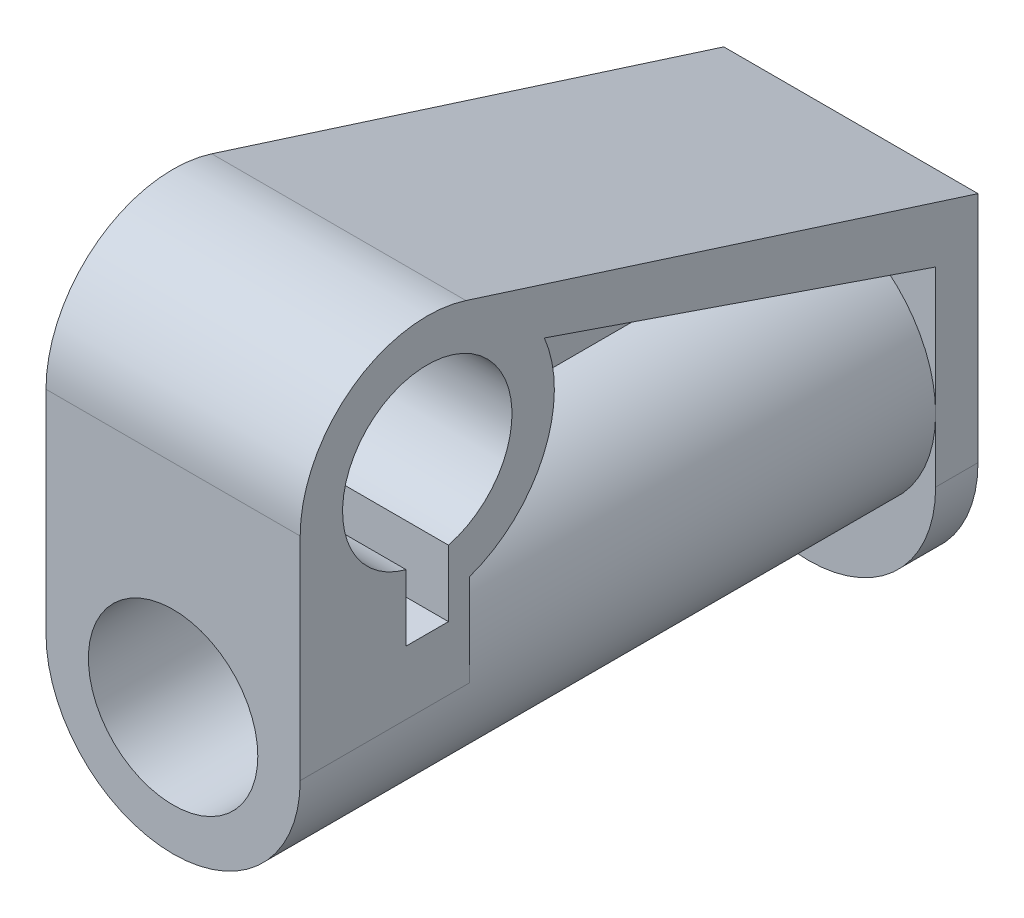
ISO-10303-21;
HEADER;
FILE_DESCRIPTION(('STEP AP214'),'2;1');
FILE_NAME('part.step','',(''),(''),'','','');
FILE_SCHEMA(('AUTOMOTIVE_DESIGN { 1 0 10303 214 1 1 1 1 }'));
ENDSEC;
DATA;
#1=APPLICATION_CONTEXT('core data for automotive mechanical design processes');
#2=APPLICATION_PROTOCOL_DEFINITION('international standard','automotive_design',2000,#1);
#3=PRODUCT_CONTEXT('',#1,'mechanical');
#4=PRODUCT('Part','Part','',(#3));
#5=PRODUCT_RELATED_PRODUCT_CATEGORY('part','',(#4));
#6=PRODUCT_DEFINITION_FORMATION('','',#4);
#7=PRODUCT_DEFINITION_CONTEXT('part definition',#1,'design');
#8=PRODUCT_DEFINITION('design','',#6,#7);
#9=PRODUCT_DEFINITION_SHAPE('','',#8);
#10=(LENGTH_UNIT() NAMED_UNIT(*) SI_UNIT(.MILLI.,.METRE.));
#11=(NAMED_UNIT(*) PLANE_ANGLE_UNIT() SI_UNIT($,.RADIAN.));
#12=(NAMED_UNIT(*) SI_UNIT($,.STERADIAN.) SOLID_ANGLE_UNIT());
#13=UNCERTAINTY_MEASURE_WITH_UNIT(LENGTH_MEASURE(1.E-05),#10,'distance_accuracy_value','');
#14=(GEOMETRIC_REPRESENTATION_CONTEXT(3) GLOBAL_UNCERTAINTY_ASSIGNED_CONTEXT((#13)) GLOBAL_UNIT_ASSIGNED_CONTEXT((#10,
#11,#12)) REPRESENTATION_CONTEXT('',''));
#15=CARTESIAN_POINT('',(0.,0.,0.));
#16=DIRECTION('',(0.,0.,1.));
#17=DIRECTION('',(1.,0.,0.));
#18=AXIS2_PLACEMENT_3D('',#15,#16,#17);
#19=CARTESIAN_POINT('',(0.,0.,80.));
#20=DIRECTION('',(0.,0.,1.));
#21=DIRECTION('',(1.,0.,0.));
#22=AXIS2_PLACEMENT_3D('',#19,#20,#21);
#23=PLANE('',#22);
#24=CARTESIAN_POINT('',(0.,0.,80.));
#25=DIRECTION('',(0.,0.,1.));
#26=DIRECTION('',(1.,0.,0.));
#27=AXIS2_PLACEMENT_3D('',#24,#25,#26);
#28=CIRCLE('',#27,15.);
#29=CARTESIAN_POINT('',(-15.,0.,80.));
#30=VERTEX_POINT('',#29);
#31=CARTESIAN_POINT('',(15.,0.,80.));
#32=VERTEX_POINT('',#31);
#33=EDGE_CURVE('E247',#30,#32,#28,.T.);
#34=ORIENTED_EDGE('',*,*,#33,.T.);
#35=DIRECTION('',(0.,-1.,0.));
#36=VECTOR('',#35,1.);
#37=CARTESIAN_POINT('',(15.,0.,80.));
#38=LINE('',#37,#36);
#39=CARTESIAN_POINT('',(15.,25.,80.));
#40=VERTEX_POINT('',#39);
#41=EDGE_CURVE('E398',#40,#32,#38,.T.);
#42=ORIENTED_EDGE('',*,*,#41,.F.);
#43=DIRECTION('',(-1.,0.,0.));
#44=VECTOR('',#43,1.);
#45=CARTESIAN_POINT('',(15.,25.,80.));
#46=LINE('',#45,#44);
#47=CARTESIAN_POINT('',(-15.,25.,80.));
#48=VERTEX_POINT('',#47);
#49=EDGE_CURVE('E211',#40,#48,#46,.T.);
#50=ORIENTED_EDGE('',*,*,#49,.T.);
#51=DIRECTION('',(0.,-1.,0.));
#52=VECTOR('',#51,1.);
#53=CARTESIAN_POINT('',(-15.,0.,80.));
#54=LINE('',#53,#52);
#55=EDGE_CURVE('E428',#48,#30,#54,.T.);
#56=ORIENTED_EDGE('',*,*,#55,.T.);
#57=EDGE_LOOP('',(#34,#42,#50,#56));
#58=FACE_BOUND('',#57,.T.);
#59=CARTESIAN_POINT('',(0.,0.,80.));
#60=DIRECTION('',(0.,0.,1.));
#61=DIRECTION('',(1.,0.,0.));
#62=AXIS2_PLACEMENT_3D('',#59,#60,#61);
#63=CIRCLE('',#62,10.);
#64=CARTESIAN_POINT('',(10.,0.,80.));
#65=VERTEX_POINT('',#64);
#66=EDGE_CURVE('E244',#65,#65,#63,.T.);
#67=ORIENTED_EDGE('',*,*,#66,.F.);
#68=EDGE_LOOP('',(#67));
#69=FACE_BOUND('',#68,.T.);
#70=ADVANCED_FACE('F35',(#58,#69),#23,.T.);
#71=CARTESIAN_POINT('',(0.,0.,0.));
#72=DIRECTION('',(0.,0.,1.));
#73=DIRECTION('',(1.,0.,0.));
#74=AXIS2_PLACEMENT_3D('',#71,#72,#73);
#75=PLANE('',#74);
#76=DIRECTION('',(0.,1.,0.));
#77=VECTOR('',#76,1.);
#78=CARTESIAN_POINT('',(-15.,0.,0.));
#79=LINE('',#78,#77);
#80=CARTESIAN_POINT('',(-15.,-7.5,0.));
#81=VERTEX_POINT('',#80);
#82=CARTESIAN_POINT('',(-15.,20.,0.));
#83=VERTEX_POINT('',#82);
#84=EDGE_CURVE('E233',#81,#83,#79,.T.);
#85=ORIENTED_EDGE('',*,*,#84,.T.);
#86=DIRECTION('',(-1.,0.,0.));
#87=VECTOR('',#86,1.);
#88=CARTESIAN_POINT('',(15.,20.,0.));
#89=LINE('',#88,#87);
#90=CARTESIAN_POINT('',(15.,20.,0.));
#91=VERTEX_POINT('',#90);
#92=EDGE_CURVE('E438',#91,#83,#89,.T.);
#93=ORIENTED_EDGE('',*,*,#92,.F.);
#94=DIRECTION('',(0.,-1.,0.));
#95=VECTOR('',#94,1.);
#96=CARTESIAN_POINT('',(15.,0.,0.));
#97=LINE('',#96,#95);
#98=CARTESIAN_POINT('',(15.,-7.5,0.));
#99=VERTEX_POINT('',#98);
#100=EDGE_CURVE('E224',#91,#99,#97,.T.);
#101=ORIENTED_EDGE('',*,*,#100,.T.);
#102=CARTESIAN_POINT('',(0.,-7.5,0.));
#103=DIRECTION('',(0.,0.,1.));
#104=DIRECTION('',(1.,0.,0.));
#105=AXIS2_PLACEMENT_3D('',#102,#103,#104);
#106=CIRCLE('',#105,15.);
#107=EDGE_CURVE('E235',#81,#99,#106,.T.);
#108=ORIENTED_EDGE('',*,*,#107,.F.);
#109=EDGE_LOOP('',(#85,#93,#101,#108));
#110=FACE_BOUND('',#109,.T.);
#111=CARTESIAN_POINT('',(0.,0.,0.));
#112=DIRECTION('',(0.,0.,1.));
#113=DIRECTION('',(1.,0.,0.));
#114=AXIS2_PLACEMENT_3D('',#111,#112,#113);
#115=CIRCLE('',#114,10.);
#116=CARTESIAN_POINT('',(10.,0.,0.));
#117=VERTEX_POINT('',#116);
#118=EDGE_CURVE('E243',#117,#117,#115,.T.);
#119=ORIENTED_EDGE('',*,*,#118,.T.);
#120=EDGE_LOOP('',(#119));
#121=FACE_BOUND('',#120,.T.);
#122=ADVANCED_FACE('F281',(#110,#121),#75,.F.);
#123=CARTESIAN_POINT('',(15.,0.,67.5));
#124=DIRECTION('',(0.,0.,-1.));
#125=DIRECTION('',(-1.,0.,0.));
#126=AXIS2_PLACEMENT_3D('',#123,#124,#125);
#127=PLANE('',#126);
#128=DIRECTION('',(-1.,0.,0.));
#129=VECTOR('',#128,1.);
#130=CARTESIAN_POINT('',(15.,7.5,67.5));
#131=LINE('',#130,#129);
#132=CARTESIAN_POINT('',(15.,7.5,67.5));
#133=VERTEX_POINT('',#132);
#134=CARTESIAN_POINT('',(6.61437827766147,7.5,67.5));
#135=VERTEX_POINT('',#134);
#136=EDGE_CURVE('E203',#133,#135,#131,.T.);
#137=ORIENTED_EDGE('',*,*,#136,.T.);
#138=CARTESIAN_POINT('',(0.,0.,67.5));
#139=DIRECTION('',(0.,0.,-1.));
#140=DIRECTION('',(-1.,0.,0.));
#141=AXIS2_PLACEMENT_3D('',#138,#139,#140);
#142=CIRCLE('',#141,10.);
#143=CARTESIAN_POINT('',(-6.61437827766147,7.5,67.5));
#144=VERTEX_POINT('',#143);
#145=EDGE_CURVE('E362',#135,#144,#142,.F.);
#146=ORIENTED_EDGE('',*,*,#145,.T.);
#147=CARTESIAN_POINT('',(-15.,7.5,67.5));
#148=VERTEX_POINT('',#147);
#149=EDGE_CURVE('E196',#144,#148,#131,.T.);
#150=ORIENTED_EDGE('',*,*,#149,.T.);
#151=DIRECTION('',(0.,-1.,0.));
#152=VECTOR('',#151,1.);
#153=CARTESIAN_POINT('',(-15.,0.,67.5));
#154=LINE('',#153,#152);
#155=CARTESIAN_POINT('',(-15.,15.3175416344815,67.5));
#156=VERTEX_POINT('',#155);
#157=EDGE_CURVE('E408',#156,#148,#154,.T.);
#158=ORIENTED_EDGE('',*,*,#157,.F.);
#159=DIRECTION('',(-1.,0.,0.));
#160=VECTOR('',#159,1.);
#161=CARTESIAN_POINT('',(15.,15.3175416344815,67.5));
#162=LINE('',#161,#160);
#163=CARTESIAN_POINT('',(15.,15.3175416344815,67.5));
#164=VERTEX_POINT('',#163);
#165=EDGE_CURVE('E402',#164,#156,#162,.T.);
#166=ORIENTED_EDGE('',*,*,#165,.F.);
#167=DIRECTION('',(0.,-1.,0.));
#168=VECTOR('',#167,1.);
#169=CARTESIAN_POINT('',(15.,0.,67.5));
#170=LINE('',#169,#168);
#171=EDGE_CURVE('E380',#164,#133,#170,.T.);
#172=ORIENTED_EDGE('',*,*,#171,.T.);
#173=EDGE_LOOP('',(#137,#146,#150,#158,#166,#172));
#174=FACE_BOUND('',#173,.T.);
#175=ADVANCED_FACE('F277',(#174),#127,.T.);
#176=CARTESIAN_POINT('',(15.,7.5,0.));
#177=DIRECTION('',(0.,1.,0.));
#178=DIRECTION('',(0.,0.,1.));
#179=AXIS2_PLACEMENT_3D('',#176,#177,#178);
#180=PLANE('',#179);
#181=DIRECTION('',(-1.,0.,0.));
#182=VECTOR('',#181,1.);
#183=CARTESIAN_POINT('',(15.,7.5,62.5));
#184=LINE('',#183,#182);
#185=CARTESIAN_POINT('',(15.,7.5,62.5));
#186=VERTEX_POINT('',#185);
#187=CARTESIAN_POINT('',(6.61437827766147,7.5,62.5));
#188=VERTEX_POINT('',#187);
#189=EDGE_CURVE('E202',#186,#188,#184,.T.);
#190=ORIENTED_EDGE('',*,*,#189,.T.);
#191=DIRECTION('',(0.,0.,-1.));
#192=VECTOR('',#191,1.);
#193=CARTESIAN_POINT('',(6.61437827766147,7.5,80.));
#194=LINE('',#193,#192);
#195=EDGE_CURVE('E50',#188,#135,#194,.F.);
#196=ORIENTED_EDGE('',*,*,#195,.T.);
#197=ORIENTED_EDGE('',*,*,#136,.F.);
#198=DIRECTION('',(0.,0.,-1.));
#199=VECTOR('',#198,1.);
#200=CARTESIAN_POINT('',(15.,7.5,0.));
#201=LINE('',#200,#199);
#202=EDGE_CURVE('E377',#133,#186,#201,.T.);
#203=ORIENTED_EDGE('',*,*,#202,.T.);
#204=EDGE_LOOP('',(#190,#196,#197,#203));
#205=FACE_BOUND('',#204,.T.);
#206=ADVANCED_FACE('F280',(#205),#180,.T.);
#207=ORIENTED_EDGE('',*,*,#149,.F.);
#208=DIRECTION('',(0.,0.,-1.));
#209=VECTOR('',#208,1.);
#210=CARTESIAN_POINT('',(-6.61437827766147,7.5,80.));
#211=LINE('',#210,#209);
#212=CARTESIAN_POINT('',(-6.61437827766147,7.5,62.5));
#213=VERTEX_POINT('',#212);
#214=EDGE_CURVE('E184',#144,#213,#211,.T.);
#215=ORIENTED_EDGE('',*,*,#214,.T.);
#216=CARTESIAN_POINT('',(-15.,7.5,62.5));
#217=VERTEX_POINT('',#216);
#218=EDGE_CURVE('E194',#213,#217,#184,.T.);
#219=ORIENTED_EDGE('',*,*,#218,.T.);
#220=DIRECTION('',(0.,0.,-1.));
#221=VECTOR('',#220,1.);
#222=CARTESIAN_POINT('',(-15.,7.5,0.));
#223=LINE('',#222,#221);
#224=EDGE_CURVE('E406',#148,#217,#223,.T.);
#225=ORIENTED_EDGE('',*,*,#224,.F.);
#226=EDGE_LOOP('',(#207,#215,#219,#225));
#227=FACE_BOUND('',#226,.T.);
#228=ADVANCED_FACE('F192',(#227),#180,.T.);
#229=CARTESIAN_POINT('',(15.,0.,62.5));
#230=DIRECTION('',(0.,0.,1.));
#231=DIRECTION('',(1.,0.,0.));
#232=AXIS2_PLACEMENT_3D('',#229,#230,#231);
#233=PLANE('',#232);
#234=ORIENTED_EDGE('',*,*,#218,.F.);
#235=CARTESIAN_POINT('',(0.,0.,62.5));
#236=DIRECTION('',(0.,0.,1.));
#237=DIRECTION('',(1.,0.,0.));
#238=AXIS2_PLACEMENT_3D('',#235,#236,#237);
#239=CIRCLE('',#238,10.);
#240=EDGE_CURVE('E182',#213,#188,#239,.F.);
#241=ORIENTED_EDGE('',*,*,#240,.T.);
#242=ORIENTED_EDGE('',*,*,#189,.F.);
#243=DIRECTION('',(0.,1.,0.));
#244=VECTOR('',#243,1.);
#245=CARTESIAN_POINT('',(15.,0.,62.5));
#246=LINE('',#245,#244);
#247=CARTESIAN_POINT('',(15.,15.3175416344814,62.5));
#248=VERTEX_POINT('',#247);
#249=EDGE_CURVE('E373',#186,#248,#246,.T.);
#250=ORIENTED_EDGE('',*,*,#249,.T.);
#251=DIRECTION('',(-1.,0.,0.));
#252=VECTOR('',#251,1.);
#253=CARTESIAN_POINT('',(15.,15.3175416344814,62.5));
#254=LINE('',#253,#252);
#255=CARTESIAN_POINT('',(-15.,15.3175416344814,62.5));
#256=VERTEX_POINT('',#255);
#257=EDGE_CURVE('E205',#248,#256,#254,.T.);
#258=ORIENTED_EDGE('',*,*,#257,.T.);
#259=DIRECTION('',(0.,1.,0.));
#260=VECTOR('',#259,1.);
#261=CARTESIAN_POINT('',(-15.,0.,62.5));
#262=LINE('',#261,#260);
#263=EDGE_CURVE('E200',#217,#256,#262,.T.);
#264=ORIENTED_EDGE('',*,*,#263,.F.);
#265=EDGE_LOOP('',(#234,#241,#242,#250,#258,#264));
#266=FACE_BOUND('',#265,.T.);
#267=ADVANCED_FACE('F198',(#266),#233,.T.);
#268=CARTESIAN_POINT('',(15.,11.8882395909423,-4.07596785975165));
#269=DIRECTION('',(0.,-0.945945945945946,0.324324324324325));
#270=DIRECTION('',(0.,-0.324324324324325,-0.945945945945946));
#271=AXIS2_PLACEMENT_3D('',#268,#269,#270);
#272=PLANE('',#271);
#273=DIRECTION('',(-1.,0.,0.));
#274=VECTOR('',#273,1.);
#275=CARTESIAN_POINT('',(15.,15.,5.));
#276=LINE('',#275,#274);
#277=CARTESIAN_POINT('',(-2.5,15.,5.));
#278=VERTEX_POINT('',#277);
#279=CARTESIAN_POINT('',(-15.,15.,5.));
#280=VERTEX_POINT('',#279);
#281=EDGE_CURVE('E441',#278,#280,#276,.T.);
#282=ORIENTED_EDGE('',*,*,#281,.F.);
#283=DIRECTION('',(0.,0.324324324324325,0.945945945945946));
#284=VECTOR('',#283,1.);
#285=CARTESIAN_POINT('',(-2.5,11.8882395909423,-4.07596785975165));
#286=LINE('',#285,#284);
#287=CARTESIAN_POINT('',(-2.5,30.8334032797301,51.1807595658793));
#288=VERTEX_POINT('',#287);
#289=EDGE_CURVE('E355',#278,#288,#286,.T.);
#290=ORIENTED_EDGE('',*,*,#289,.T.);
#291=DIRECTION('',(-1.,0.,0.));
#292=VECTOR('',#291,1.);
#293=CARTESIAN_POINT('',(15.,30.8334032797301,51.1807595658793));
#294=LINE('',#293,#292);
#295=CARTESIAN_POINT('',(-15.,30.8334032797301,51.1807595658793));
#296=VERTEX_POINT('',#295);
#297=EDGE_CURVE('E443',#288,#296,#294,.T.);
#298=ORIENTED_EDGE('',*,*,#297,.T.);
#299=DIRECTION('',(0.,0.324324324324325,0.945945945945946));
#300=VECTOR('',#299,1.);
#301=CARTESIAN_POINT('',(-15.,11.8882395909423,-4.07596785975165));
#302=LINE('',#301,#300);
#303=EDGE_CURVE('E416',#280,#296,#302,.T.);
#304=ORIENTED_EDGE('',*,*,#303,.F.);
#305=EDGE_LOOP('',(#282,#290,#298,#304));
#306=FACE_BOUND('',#305,.T.);
#307=ADVANCED_FACE('F288',(#306),#272,.T.);
#308=CARTESIAN_POINT('',(15.,0.,5.));
#309=DIRECTION('',(0.,0.,-1.));
#310=DIRECTION('',(-1.,0.,0.));
#311=AXIS2_PLACEMENT_3D('',#308,#309,#310);
#312=PLANE('',#311);
#313=DIRECTION('',(0.,-1.,0.));
#314=VECTOR('',#313,1.);
#315=CARTESIAN_POINT('',(-2.5,0.,5.));
#316=LINE('',#315,#314);
#317=CARTESIAN_POINT('',(-2.5,14.790199457749,5.));
#318=VERTEX_POINT('',#317);
#319=EDGE_CURVE('E58',#278,#318,#316,.T.);
#320=ORIENTED_EDGE('',*,*,#319,.F.);
#321=ORIENTED_EDGE('',*,*,#281,.T.);
#322=DIRECTION('',(0.,-1.,0.));
#323=VECTOR('',#322,1.);
#324=CARTESIAN_POINT('',(-15.,0.,5.));
#325=LINE('',#324,#323);
#326=CARTESIAN_POINT('',(-15.,0.,5.));
#327=VERTEX_POINT('',#326);
#328=EDGE_CURVE('E419',#280,#327,#325,.T.);
#329=ORIENTED_EDGE('',*,*,#328,.T.);
#330=CARTESIAN_POINT('',(0.,0.,5.));
#331=DIRECTION('',(0.,0.,-1.));
#332=DIRECTION('',(-1.,0.,0.));
#333=AXIS2_PLACEMENT_3D('',#330,#331,#332);
#334=CIRCLE('',#333,15.);
#335=EDGE_CURVE('E214',#327,#318,#334,.T.);
#336=ORIENTED_EDGE('',*,*,#335,.T.);
#337=EDGE_LOOP('',(#320,#321,#329,#336));
#338=FACE_BOUND('',#337,.T.);
#339=ADVANCED_FACE('F334',(#338),#312,.F.);
#340=CARTESIAN_POINT('',(15.,25.,65.));
#341=DIRECTION('',(-1.,0.,0.));
#342=DIRECTION('',(0.,0.,1.));
#343=AXIS2_PLACEMENT_3D('',#340,#341,#342);
#344=CYLINDRICAL_SURFACE('',#343,15.);
#345=CARTESIAN_POINT('',(-2.5,25.,65.));
#346=DIRECTION('',(1.,0.,0.));
#347=DIRECTION('',(0.,0.,-1.));
#348=AXIS2_PLACEMENT_3D('',#345,#346,#347);
#349=CIRCLE('',#348,15.);
#350=CARTESIAN_POINT('',(-2.5,14.790199457749,54.0109157393597));
#351=VERTEX_POINT('',#350);
#352=EDGE_CURVE('E43',#351,#288,#349,.T.);
#353=ORIENTED_EDGE('',*,*,#352,.F.);
#354=CARTESIAN_POINT('',(10.3492406091726,10.857864376269,60.));
#355=CARTESIAN_POINT('',(10.3013479463618,10.9035109942008,59.870885806738));
#356=CARTESIAN_POINT('',(10.2512431199434,10.950666630797,59.7431435353525));
#357=CARTESIAN_POINT('',(10.1465230255653,11.0477682289101,59.4905966826438));
#358=CARTESIAN_POINT('',(10.0919075988138,11.0977142886415,59.3657922049421));
#359=CARTESIAN_POINT('',(9.92117955542118,11.2513842890924,58.9961071441372));
#360=CARTESIAN_POINT('',(9.79817844321052,11.3589465551498,58.7559366633505));
#361=CARTESIAN_POINT('',(9.53371462383054,11.5818012657551,58.2904201592094));
#362=CARTESIAN_POINT('',(9.39228298615716,11.697080545675,58.0650501264063));
#363=CARTESIAN_POINT('',(9.09070186490556,11.9329696259504,57.6302042948728));
#364=CARTESIAN_POINT('',(8.93055452542403,12.0535788147215,57.4207266800107));
#365=CARTESIAN_POINT('',(8.5913839410329,12.2976361966784,57.0184305089834));
#366=CARTESIAN_POINT('',(8.41231752886235,12.4210903569795,56.8256519599644));
#367=CARTESIAN_POINT('',(8.03623732524408,12.6676529995788,56.4582093576034));
#368=CARTESIAN_POINT('',(7.83922265229239,12.7907614645922,56.2835461948753));
#369=CARTESIAN_POINT('',(7.42841553821065,13.0336305734116,55.953008765871));
#370=CARTESIAN_POINT('',(7.21463591996703,13.1533936826774,55.797120366492));
#371=CARTESIAN_POINT('',(6.77150186844577,13.3869143367741,55.5041403126577));
#372=CARTESIAN_POINT('',(6.54214782604897,13.5006720321993,55.3670481867212));
#373=CARTESIAN_POINT('',(6.07637019742394,13.7164744119573,55.1152263501574));
#374=CARTESIAN_POINT('',(5.84034996027691,13.8187644585032,54.9999595930713));
#375=CARTESIAN_POINT('',(5.35672720277089,14.013329659706,54.7865808114064));
#376=CARTESIAN_POINT('',(5.10912488830294,14.1056049922946,54.6884684820253));
#377=CARTESIAN_POINT('',(4.60384720477961,14.2785133339087,54.5087994982605));
#378=CARTESIAN_POINT('',(4.34616511683405,14.3591384031807,54.4272541191717));
#379=CARTESIAN_POINT('',(3.82259492560288,14.5073016158104,54.2801968899058));
#380=CARTESIAN_POINT('',(3.55670648359585,14.5748392181365,54.2146857025474));
#381=CARTESIAN_POINT('',(3.0049302304355,14.6987856716791,54.0962065775011));
#382=CARTESIAN_POINT('',(2.7187081905809,14.7544664923577,54.0440325153777));
#383=CARTESIAN_POINT('',(2.14105215038554,14.8492955900051,53.956115694026));
#384=CARTESIAN_POINT('',(1.8496180024697,14.8884433980851,53.9203734008125));
#385=CARTESIAN_POINT('',(1.26342204507633,14.9496024773845,53.8648656071368));
#386=CARTESIAN_POINT('',(0.968659909629323,14.9716120549151,53.8451016857326));
#387=CARTESIAN_POINT('',(0.377715597667956,14.9981606001093,53.8212915184893));
#388=CARTESIAN_POINT('',(0.0815333834643767,15.0026991014877,53.8172456921501));
#389=CARTESIAN_POINT('',(-0.525854747565997,14.9940143181272,53.8250145420136));
#390=CARTESIAN_POINT('',(-0.837037281232423,14.9798508465895,53.8376687454264));
#391=CARTESIAN_POINT('',(-1.45673059761409,14.9323311018804,53.8805098315257));
#392=CARTESIAN_POINT('',(-1.76524127678686,14.8989740882494,53.9106973906245));
#393=CARTESIAN_POINT('',(-2.37744000691151,14.813619063705,53.9890509497856));
#394=CARTESIAN_POINT('',(-2.68112699999623,14.7616170211814,54.0372208382552));
#395=CARTESIAN_POINT('',(-3.28134666748368,14.6398949767584,54.1521787108065));
#396=CARTESIAN_POINT('',(-3.57787948200419,14.5701753221751,54.2189663299294));
#397=CARTESIAN_POINT('',(-4.16087359803091,14.4145051351282,54.3717752847687));
#398=CARTESIAN_POINT('',(-4.44735503519581,14.3285895445592,54.4577552861099));
#399=CARTESIAN_POINT('',(-5.00860572154086,14.1421815403093,54.6498465192202));
#400=CARTESIAN_POINT('',(-5.2833749099694,14.0416890510296,54.7559578553953));
#401=CARTESIAN_POINT('',(-5.81870381108315,13.8284356011453,54.988953472021));
#402=CARTESIAN_POINT('',(-6.07927502402648,13.7156847983004,55.115820596695));
#403=CARTESIAN_POINT('',(-6.5842853395435,13.4805325659189,55.3909113980138));
#404=CARTESIAN_POINT('',(-6.82872569774022,13.3581318891585,55.539133409532));
#405=CARTESIAN_POINT('',(-7.28627516336773,13.1138716937948,55.8481419819904));
#406=CARTESIAN_POINT('',(-7.5003738130921,12.9923710576131,56.0077482990778));
#407=CARTESIAN_POINT('',(-7.9111840447845,12.7463912357926,56.3459391980248));
#408=CARTESIAN_POINT('',(-8.10789546516411,12.6219120224861,56.5245239562268));
#409=CARTESIAN_POINT('',(-8.48296274198202,12.3729559299486,56.9000915449798));
#410=CARTESIAN_POINT('',(-8.6613154840601,12.2484790546832,57.0970774863256));
#411=CARTESIAN_POINT('',(-8.99901227352049,12.0025585212478,57.5084126445016));
#412=CARTESIAN_POINT('',(-9.15836017221236,11.8811142524809,57.7227583285667));
#413=CARTESIAN_POINT('',(-9.41381997197696,11.6789634390396,58.1020535549206));
#414=CARTESIAN_POINT('',(-9.51475113840254,11.5967758743611,58.2630015926787));
#415=CARTESIAN_POINT('',(-9.70709128751487,11.4362606983049,58.5923080909911));
#416=CARTESIAN_POINT('',(-9.79850195594718,11.3579324048847,58.7606652321179));
#417=CARTESIAN_POINT('',(-9.97180513941914,11.2060866813112,59.1039752166073));
#418=CARTESIAN_POINT('',(-10.0537100211949,11.1325630561341,59.2789190890954));
#419=CARTESIAN_POINT('',(-10.2083281422929,10.9909495374206,59.6349882759924));
#420=CARTESIAN_POINT('',(-10.2810403239,10.922860269495,59.8161142986821));
#421=CARTESIAN_POINT('',(-10.3492406091726,10.857864376269,60.));
#422=B_SPLINE_CURVE_WITH_KNOTS('',3,(#354,#355,#356,#357,#358,#359,#360,#361,#362,#363,#364,
#365,#366,#367,#368,#369,#370,#371,#372,#373,#374,#375,#376,#377,#378,#379,#380,#381,#382,#383,
#384,#385,#386,#387,#388,#389,#390,#391,#392,#393,#394,#395,#396,#397,#398,#399,#400,#401,#402,
#403,#404,#405,#406,#407,#408,#409,#410,#411,#412,#413,#414,#415,#416,#417,#418,#419,#420,#421),
.UNSPECIFIED.,.F.,.F.,(4,2,2,2,2,2,2,2,2,2,2,2,2,2,2,2,2,2,2,2,2,2,2,2,2,2,2,2,2,2,2,2,2,4),(0.,
0.435171650149217,0.870358626688378,1.74067119039863,2.60953514701786,3.47829966277551,
4.34909107505001,5.21992527811951,6.09009978966451,6.96025246997483,7.80493882209817,
8.64961016419299,9.49485446913802,10.3401337087497,11.2278067749524,12.1155050145522,
13.0032909699577,13.8911006192968,14.8252858148959,15.7595070524541,16.6939304183889,
17.6283354683453,18.5607471932216,19.4931637539431,20.4248134801614,21.3563906011708,
22.2354231150412,23.1144637973522,23.9936533549329,24.8726644419428,25.493283128984,
26.1137917387763,26.733483815664,27.3532471297583),.UNSPECIFIED.);
#423=CARTESIAN_POINT('',(-10.3492406091726,10.857864376269,60.));
#424=VERTEX_POINT('',#423);
#425=EDGE_CURVE('E250',#351,#424,#422,.T.);
#426=ORIENTED_EDGE('',*,*,#425,.T.);
#427=DIRECTION('',(-1.,0.,0.));
#428=VECTOR('',#427,1.);
#429=CARTESIAN_POINT('',(15.,10.857864376269,60.));
#430=LINE('',#429,#428);
#431=CARTESIAN_POINT('',(-15.,10.857864376269,60.));
#432=VERTEX_POINT('',#431);
#433=EDGE_CURVE('E447',#424,#432,#430,.T.);
#434=ORIENTED_EDGE('',*,*,#433,.T.);
#435=CARTESIAN_POINT('',(-15.,25.,65.));
#436=DIRECTION('',(1.,0.,0.));
#437=DIRECTION('',(0.,0.,-1.));
#438=AXIS2_PLACEMENT_3D('',#435,#436,#437);
#439=CIRCLE('',#438,15.);
#440=EDGE_CURVE('E413',#432,#296,#439,.T.);
#441=ORIENTED_EDGE('',*,*,#440,.T.);
#442=ORIENTED_EDGE('',*,*,#297,.F.);
#443=EDGE_LOOP('',(#353,#426,#434,#441,#442));
#444=FACE_BOUND('',#443,.T.);
#445=ADVANCED_FACE('F270',(#444),#344,.T.);
#446=CARTESIAN_POINT('',(0.,0.,80.));
#447=DIRECTION('',(0.,0.,-1.));
#448=DIRECTION('',(-1.,0.,0.));
#449=AXIS2_PLACEMENT_3D('',#446,#447,#448);
#450=CYLINDRICAL_SURFACE('',#449,15.);
#451=CARTESIAN_POINT('',(2.5,14.790199457749,5.));
#452=VERTEX_POINT('',#451);
#453=CARTESIAN_POINT('',(15.,0.,5.));
#454=VERTEX_POINT('',#453);
#455=EDGE_CURVE('E212',#452,#454,#334,.T.);
#456=ORIENTED_EDGE('',*,*,#455,.F.);
#457=DIRECTION('',(0.,0.,-1.));
#458=VECTOR('',#457,1.);
#459=CARTESIAN_POINT('',(2.5,14.790199457749,80.));
#460=LINE('',#459,#458);
#461=CARTESIAN_POINT('',(2.5,14.790199457749,54.0109157393597));
#462=VERTEX_POINT('',#461);
#463=EDGE_CURVE('E339',#452,#462,#460,.F.);
#464=ORIENTED_EDGE('',*,*,#463,.T.);
#465=CARTESIAN_POINT('',(10.3492406091726,10.857864376269,60.));
#466=VERTEX_POINT('',#465);
#467=EDGE_CURVE('E253',#466,#462,#422,.T.);
#468=ORIENTED_EDGE('',*,*,#467,.F.);
#469=CARTESIAN_POINT('',(0.,0.,60.));
#470=DIRECTION('',(0.,0.,-1.));
#471=DIRECTION('',(-1.,0.,0.));
#472=AXIS2_PLACEMENT_3D('',#469,#470,#471);
#473=CIRCLE('',#472,15.);
#474=CARTESIAN_POINT('',(15.,0.,60.));
#475=VERTEX_POINT('',#474);
#476=EDGE_CURVE('E216',#466,#475,#473,.T.);
#477=ORIENTED_EDGE('',*,*,#476,.T.);
#478=DIRECTION('',(0.,0.,-1.));
#479=VECTOR('',#478,1.);
#480=CARTESIAN_POINT('',(15.,0.,0.));
#481=LINE('',#480,#479);
#482=EDGE_CURVE('E400',#32,#475,#481,.T.);
#483=ORIENTED_EDGE('',*,*,#482,.F.);
#484=ORIENTED_EDGE('',*,*,#33,.F.);
#485=DIRECTION('',(0.,0.,-1.));
#486=VECTOR('',#485,1.);
#487=CARTESIAN_POINT('',(-15.,0.,0.));
#488=LINE('',#487,#486);
#489=CARTESIAN_POINT('',(-15.,0.,60.));
#490=VERTEX_POINT('',#489);
#491=EDGE_CURVE('E374',#30,#490,#488,.T.);
#492=ORIENTED_EDGE('',*,*,#491,.T.);
#493=EDGE_CURVE('E219',#490,#424,#473,.T.);
#494=ORIENTED_EDGE('',*,*,#493,.T.);
#495=ORIENTED_EDGE('',*,*,#425,.F.);
#496=DIRECTION('',(0.,0.,-1.));
#497=VECTOR('',#496,1.);
#498=CARTESIAN_POINT('',(-2.5,14.790199457749,80.));
#499=LINE('',#498,#497);
#500=EDGE_CURVE('E357',#318,#351,#499,.F.);
#501=ORIENTED_EDGE('',*,*,#500,.F.);
#502=ORIENTED_EDGE('',*,*,#335,.F.);
#503=CARTESIAN_POINT('',(0.,0.,5.));
#504=DIRECTION('',(0.,0.,1.));
#505=DIRECTION('',(1.,0.,0.));
#506=AXIS2_PLACEMENT_3D('',#503,#504,#505);
#507=CIRCLE('',#506,15.);
#508=EDGE_CURVE('E229',#327,#454,#507,.T.);
#509=ORIENTED_EDGE('',*,*,#508,.T.);
#510=EDGE_LOOP('',(#456,#464,#468,#477,#483,#484,#492,#494,#495,#501,#502,#509));
#511=FACE_BOUND('',#510,.T.);
#512=ADVANCED_FACE('F259',(#511),#450,.T.);
#513=CARTESIAN_POINT('',(0.,0.,80.));
#514=DIRECTION('',(0.,0.,-1.));
#515=DIRECTION('',(-1.,0.,0.));
#516=AXIS2_PLACEMENT_3D('',#513,#514,#515);
#517=CYLINDRICAL_SURFACE('',#516,10.);
#518=ORIENTED_EDGE('',*,*,#66,.T.);
#519=EDGE_LOOP('',(#518));
#520=FACE_BOUND('',#519,.T.);
#521=ORIENTED_EDGE('',*,*,#118,.F.);
#522=EDGE_LOOP('',(#521));
#523=FACE_BOUND('',#522,.T.);
#524=ORIENTED_EDGE('',*,*,#195,.F.);
#525=ORIENTED_EDGE('',*,*,#240,.F.);
#526=ORIENTED_EDGE('',*,*,#214,.F.);
#527=ORIENTED_EDGE('',*,*,#145,.F.);
#528=EDGE_LOOP('',(#524,#525,#526,#527));
#529=FACE_BOUND('',#528,.T.);
#530=ADVANCED_FACE('F37',(#520,#523,#529),#517,.F.);
#531=CARTESIAN_POINT('',(-15.,0.,5.));
#532=DIRECTION('',(-1.,0.,0.));
#533=DIRECTION('',(0.,0.,1.));
#534=AXIS2_PLACEMENT_3D('',#531,#532,#533);
#535=PLANE('',#534);
#536=ORIENTED_EDGE('',*,*,#84,.F.);
#537=DIRECTION('',(0.,0.,-1.));
#538=VECTOR('',#537,1.);
#539=CARTESIAN_POINT('',(-15.,-7.5,5.));
#540=LINE('',#539,#538);
#541=CARTESIAN_POINT('',(-15.,-7.5,5.));
#542=VERTEX_POINT('',#541);
#543=EDGE_CURVE('E241',#542,#81,#540,.T.);
#544=ORIENTED_EDGE('',*,*,#543,.F.);
#545=DIRECTION('',(0.,1.,0.));
#546=VECTOR('',#545,1.);
#547=CARTESIAN_POINT('',(-15.,0.,5.));
#548=LINE('',#547,#546);
#549=EDGE_CURVE('E220',#542,#327,#548,.T.);
#550=ORIENTED_EDGE('',*,*,#549,.T.);
#551=ORIENTED_EDGE('',*,*,#328,.F.);
#552=ORIENTED_EDGE('',*,*,#303,.T.);
#553=ORIENTED_EDGE('',*,*,#440,.F.);
#554=DIRECTION('',(0.,-1.,0.));
#555=VECTOR('',#554,1.);
#556=CARTESIAN_POINT('',(-15.,0.,60.));
#557=LINE('',#556,#555);
#558=EDGE_CURVE('E411',#432,#490,#557,.T.);
#559=ORIENTED_EDGE('',*,*,#558,.T.);
#560=ORIENTED_EDGE('',*,*,#491,.F.);
#561=ORIENTED_EDGE('',*,*,#55,.F.);
#562=CARTESIAN_POINT('',(-15.,25.,65.));
#563=DIRECTION('',(1.,0.,0.));
#564=DIRECTION('',(0.,0.,-1.));
#565=AXIS2_PLACEMENT_3D('',#562,#563,#564);
#566=CIRCLE('',#565,15.);
#567=CARTESIAN_POINT('',(-15.,39.2898389434568,60.4392431581956));
#568=VERTEX_POINT('',#567);
#569=EDGE_CURVE('E425',#568,#48,#566,.T.);
#570=ORIENTED_EDGE('',*,*,#569,.F.);
#571=DIRECTION('',(0.,0.304050456120291,0.952655929563787));
#572=VECTOR('',#571,1.);
#573=CARTESIAN_POINT('',(-15.,18.1510664026609,-5.79310939819139));
#574=LINE('',#573,#572);
#575=EDGE_CURVE('E422',#83,#568,#574,.T.);
#576=ORIENTED_EDGE('',*,*,#575,.F.);
#577=EDGE_LOOP('',(#536,#544,#550,#551,#552,#553,#559,#560,#561,#570,#576));
#578=FACE_BOUND('',#577,.T.);
#579=CARTESIAN_POINT('',(-15.,25.,65.));
#580=DIRECTION('',(1.,0.,0.));
#581=DIRECTION('',(0.,0.,-1.));
#582=AXIS2_PLACEMENT_3D('',#579,#580,#581);
#583=CIRCLE('',#582,10.);
#584=EDGE_CURVE('E369',#256,#156,#583,.T.);
#585=ORIENTED_EDGE('',*,*,#584,.T.);
#586=ORIENTED_EDGE('',*,*,#157,.T.);
#587=ORIENTED_EDGE('',*,*,#224,.T.);
#588=ORIENTED_EDGE('',*,*,#263,.T.);
#589=EDGE_LOOP('',(#585,#586,#587,#588));
#590=FACE_BOUND('',#589,.T.);
#591=ADVANCED_FACE('F305',(#578,#590),#535,.T.);
#592=CARTESIAN_POINT('',(0.,-7.5,5.));
#593=DIRECTION('',(0.,0.,-1.));
#594=DIRECTION('',(-1.,0.,0.));
#595=AXIS2_PLACEMENT_3D('',#592,#593,#594);
#596=CYLINDRICAL_SURFACE('',#595,15.);
#597=ORIENTED_EDGE('',*,*,#107,.T.);
#598=DIRECTION('',(0.,0.,-1.));
#599=VECTOR('',#598,1.);
#600=CARTESIAN_POINT('',(15.,-7.5,5.));
#601=LINE('',#600,#599);
#602=CARTESIAN_POINT('',(15.,-7.5,5.));
#603=VERTEX_POINT('',#602);
#604=EDGE_CURVE('E232',#603,#99,#601,.T.);
#605=ORIENTED_EDGE('',*,*,#604,.F.);
#606=CARTESIAN_POINT('',(0.,-7.5,5.));
#607=DIRECTION('',(0.,0.,1.));
#608=DIRECTION('',(1.,0.,0.));
#609=AXIS2_PLACEMENT_3D('',#606,#607,#608);
#610=CIRCLE('',#609,15.);
#611=EDGE_CURVE('E223',#542,#603,#610,.T.);
#612=ORIENTED_EDGE('',*,*,#611,.F.);
#613=ORIENTED_EDGE('',*,*,#543,.T.);
#614=EDGE_LOOP('',(#597,#605,#612,#613));
#615=FACE_BOUND('',#614,.T.);
#616=ADVANCED_FACE('F301',(#615),#596,.T.);
#617=CARTESIAN_POINT('',(15.,0.,5.));
#618=DIRECTION('',(1.,0.,0.));
#619=DIRECTION('',(0.,0.,-1.));
#620=AXIS2_PLACEMENT_3D('',#617,#618,#619);
#621=PLANE('',#620);
#622=ORIENTED_EDGE('',*,*,#100,.F.);
#623=DIRECTION('',(0.,0.304050456120291,0.952655929563787));
#624=VECTOR('',#623,1.);
#625=CARTESIAN_POINT('',(15.,18.1510664026609,-5.79310939819139));
#626=LINE('',#625,#624);
#627=CARTESIAN_POINT('',(15.,39.2898389434568,60.4392431581956));
#628=VERTEX_POINT('',#627);
#629=EDGE_CURVE('E392',#91,#628,#626,.T.);
#630=ORIENTED_EDGE('',*,*,#629,.T.);
#631=CARTESIAN_POINT('',(15.,25.,65.));
#632=DIRECTION('',(1.,0.,0.));
#633=DIRECTION('',(0.,0.,-1.));
#634=AXIS2_PLACEMENT_3D('',#631,#632,#633);
#635=CIRCLE('',#634,15.);
#636=EDGE_CURVE('E395',#628,#40,#635,.T.);
#637=ORIENTED_EDGE('',*,*,#636,.T.);
#638=ORIENTED_EDGE('',*,*,#41,.T.);
#639=ORIENTED_EDGE('',*,*,#482,.T.);
#640=DIRECTION('',(0.,-1.,0.));
#641=VECTOR('',#640,1.);
#642=CARTESIAN_POINT('',(15.,0.,60.));
#643=LINE('',#642,#641);
#644=CARTESIAN_POINT('',(15.,10.857864376269,60.));
#645=VERTEX_POINT('',#644);
#646=EDGE_CURVE('E383',#645,#475,#643,.T.);
#647=ORIENTED_EDGE('',*,*,#646,.F.);
#648=CARTESIAN_POINT('',(15.,25.,65.));
#649=DIRECTION('',(1.,0.,0.));
#650=DIRECTION('',(0.,0.,-1.));
#651=AXIS2_PLACEMENT_3D('',#648,#649,#650);
#652=CIRCLE('',#651,15.);
#653=CARTESIAN_POINT('',(15.,30.8334032797301,51.1807595658793));
#654=VERTEX_POINT('',#653);
#655=EDGE_CURVE('E386',#645,#654,#652,.T.);
#656=ORIENTED_EDGE('',*,*,#655,.T.);
#657=DIRECTION('',(0.,0.324324324324325,0.945945945945946));
#658=VECTOR('',#657,1.);
#659=CARTESIAN_POINT('',(15.,11.8882395909423,-4.07596785975165));
#660=LINE('',#659,#658);
#661=CARTESIAN_POINT('',(15.,15.,5.));
#662=VERTEX_POINT('',#661);
#663=EDGE_CURVE('E388',#662,#654,#660,.T.);
#664=ORIENTED_EDGE('',*,*,#663,.F.);
#665=DIRECTION('',(0.,-1.,0.));
#666=VECTOR('',#665,1.);
#667=CARTESIAN_POINT('',(15.,0.,5.));
#668=LINE('',#667,#666);
#669=EDGE_CURVE('E348',#662,#454,#668,.T.);
#670=ORIENTED_EDGE('',*,*,#669,.T.);
#671=DIRECTION('',(0.,-1.,0.));
#672=VECTOR('',#671,1.);
#673=CARTESIAN_POINT('',(15.,0.,5.));
#674=LINE('',#673,#672);
#675=EDGE_CURVE('E226',#454,#603,#674,.T.);
#676=ORIENTED_EDGE('',*,*,#675,.T.);
#677=ORIENTED_EDGE('',*,*,#604,.T.);
#678=EDGE_LOOP('',(#622,#630,#637,#638,#639,#647,#656,#664,#670,#676,#677));
#679=FACE_BOUND('',#678,.T.);
#680=CARTESIAN_POINT('',(15.,25.,65.));
#681=DIRECTION('',(1.,0.,0.));
#682=DIRECTION('',(0.,0.,-1.));
#683=AXIS2_PLACEMENT_3D('',#680,#681,#682);
#684=CIRCLE('',#683,10.);
#685=EDGE_CURVE('E370',#248,#164,#684,.T.);
#686=ORIENTED_EDGE('',*,*,#685,.F.);
#687=ORIENTED_EDGE('',*,*,#249,.F.);
#688=ORIENTED_EDGE('',*,*,#202,.F.);
#689=ORIENTED_EDGE('',*,*,#171,.F.);
#690=EDGE_LOOP('',(#686,#687,#688,#689));
#691=FACE_BOUND('',#690,.T.);
#692=ADVANCED_FACE('F297',(#679,#691),#621,.T.);
#693=CARTESIAN_POINT('',(0.,0.,5.));
#694=DIRECTION('',(0.,0.,1.));
#695=DIRECTION('',(1.,0.,0.));
#696=AXIS2_PLACEMENT_3D('',#693,#694,#695);
#697=PLANE('',#696);
#698=ORIENTED_EDGE('',*,*,#549,.F.);
#699=ORIENTED_EDGE('',*,*,#611,.T.);
#700=ORIENTED_EDGE('',*,*,#675,.F.);
#701=ORIENTED_EDGE('',*,*,#508,.F.);
#702=EDGE_LOOP('',(#698,#699,#700,#701));
#703=FACE_BOUND('',#702,.T.);
#704=ADVANCED_FACE('F293',(#703),#697,.T.);
#705=CARTESIAN_POINT('',(15.,25.,65.));
#706=DIRECTION('',(-1.,0.,0.));
#707=DIRECTION('',(0.,0.,1.));
#708=AXIS2_PLACEMENT_3D('',#705,#706,#707);
#709=CYLINDRICAL_SURFACE('',#708,10.);
#710=ORIENTED_EDGE('',*,*,#584,.F.);
#711=ORIENTED_EDGE('',*,*,#257,.F.);
#712=ORIENTED_EDGE('',*,*,#685,.T.);
#713=ORIENTED_EDGE('',*,*,#165,.T.);
#714=EDGE_LOOP('',(#710,#711,#712,#713));
#715=FACE_BOUND('',#714,.T.);
#716=ADVANCED_FACE('F289',(#715),#709,.F.);
#717=CARTESIAN_POINT('',(15.,25.,65.));
#718=DIRECTION('',(-1.,0.,0.));
#719=DIRECTION('',(0.,0.,1.));
#720=AXIS2_PLACEMENT_3D('',#717,#718,#719);
#721=CYLINDRICAL_SURFACE('',#720,15.);
#722=ORIENTED_EDGE('',*,*,#569,.T.);
#723=ORIENTED_EDGE('',*,*,#49,.F.);
#724=ORIENTED_EDGE('',*,*,#636,.F.);
#725=DIRECTION('',(-1.,0.,0.));
#726=VECTOR('',#725,1.);
#727=CARTESIAN_POINT('',(15.,39.2898389434568,60.4392431581956));
#728=LINE('',#727,#726);
#729=EDGE_CURVE('E435',#628,#568,#728,.T.);
#730=ORIENTED_EDGE('',*,*,#729,.T.);
#731=EDGE_LOOP('',(#722,#723,#724,#730));
#732=FACE_BOUND('',#731,.T.);
#733=ADVANCED_FACE('F292',(#732),#721,.T.);
#734=CARTESIAN_POINT('',(15.,18.1510664026609,-5.79310939819139));
#735=DIRECTION('',(0.,-0.952655929563787,0.304050456120291));
#736=DIRECTION('',(0.,-0.304050456120291,-0.952655929563787));
#737=AXIS2_PLACEMENT_3D('',#734,#735,#736);
#738=PLANE('',#737);
#739=ORIENTED_EDGE('',*,*,#575,.T.);
#740=ORIENTED_EDGE('',*,*,#729,.F.);
#741=ORIENTED_EDGE('',*,*,#629,.F.);
#742=ORIENTED_EDGE('',*,*,#92,.T.);
#743=EDGE_LOOP('',(#739,#740,#741,#742));
#744=FACE_BOUND('',#743,.T.);
#745=ADVANCED_FACE('F473',(#744),#738,.F.);
#746=DIRECTION('',(0.,0.324324324324325,0.945945945945946));
#747=VECTOR('',#746,1.);
#748=CARTESIAN_POINT('',(2.5,11.8882395909423,-4.07596785975165));
#749=LINE('',#748,#747);
#750=CARTESIAN_POINT('',(2.5,15.,5.));
#751=VERTEX_POINT('',#750);
#752=CARTESIAN_POINT('',(2.5,30.8334032797301,51.1807595658793));
#753=VERTEX_POINT('',#752);
#754=EDGE_CURVE('E354',#751,#753,#749,.T.);
#755=ORIENTED_EDGE('',*,*,#754,.F.);
#756=EDGE_CURVE('E351',#662,#751,#276,.T.);
#757=ORIENTED_EDGE('',*,*,#756,.F.);
#758=ORIENTED_EDGE('',*,*,#663,.T.);
#759=EDGE_CURVE('E444',#654,#753,#294,.T.);
#760=ORIENTED_EDGE('',*,*,#759,.T.);
#761=EDGE_LOOP('',(#755,#757,#758,#760));
#762=FACE_BOUND('',#761,.T.);
#763=ADVANCED_FACE('F271',(#762),#272,.T.);
#764=ORIENTED_EDGE('',*,*,#756,.T.);
#765=DIRECTION('',(0.,-1.,0.));
#766=VECTOR('',#765,1.);
#767=CARTESIAN_POINT('',(2.5,0.,5.));
#768=LINE('',#767,#766);
#769=EDGE_CURVE('E350',#751,#452,#768,.T.);
#770=ORIENTED_EDGE('',*,*,#769,.T.);
#771=ORIENTED_EDGE('',*,*,#455,.T.);
#772=ORIENTED_EDGE('',*,*,#669,.F.);
#773=EDGE_LOOP('',(#764,#770,#771,#772));
#774=FACE_BOUND('',#773,.T.);
#775=ADVANCED_FACE('F346',(#774),#312,.F.);
#776=CARTESIAN_POINT('',(15.,0.,60.));
#777=DIRECTION('',(0.,0.,-1.));
#778=DIRECTION('',(-1.,0.,0.));
#779=AXIS2_PLACEMENT_3D('',#776,#777,#778);
#780=PLANE('',#779);
#781=ORIENTED_EDGE('',*,*,#476,.F.);
#782=EDGE_CURVE('E215',#645,#466,#430,.T.);
#783=ORIENTED_EDGE('',*,*,#782,.F.);
#784=ORIENTED_EDGE('',*,*,#646,.T.);
#785=EDGE_LOOP('',(#781,#783,#784));
#786=FACE_BOUND('',#785,.T.);
#787=ADVANCED_FACE('F275',(#786),#780,.T.);
#788=ORIENTED_EDGE('',*,*,#493,.F.);
#789=ORIENTED_EDGE('',*,*,#558,.F.);
#790=ORIENTED_EDGE('',*,*,#433,.F.);
#791=EDGE_LOOP('',(#788,#789,#790));
#792=FACE_BOUND('',#791,.T.);
#793=ADVANCED_FACE('F268',(#792),#780,.T.);
#794=ORIENTED_EDGE('',*,*,#467,.T.);
#795=CARTESIAN_POINT('',(2.5,25.,65.));
#796=DIRECTION('',(1.,0.,0.));
#797=DIRECTION('',(0.,0.,-1.));
#798=AXIS2_PLACEMENT_3D('',#795,#796,#797);
#799=CIRCLE('',#798,15.);
#800=EDGE_CURVE('E11',#462,#753,#799,.T.);
#801=ORIENTED_EDGE('',*,*,#800,.T.);
#802=ORIENTED_EDGE('',*,*,#759,.F.);
#803=ORIENTED_EDGE('',*,*,#655,.F.);
#804=ORIENTED_EDGE('',*,*,#782,.T.);
#805=EDGE_LOOP('',(#794,#801,#802,#803,#804));
#806=FACE_BOUND('',#805,.T.);
#807=ADVANCED_FACE('F262',(#806),#344,.T.);
#808=CARTESIAN_POINT('',(-2.5,0.,0.));
#809=DIRECTION('',(1.,0.,0.));
#810=DIRECTION('',(0.,0.,-1.));
#811=AXIS2_PLACEMENT_3D('',#808,#809,#810);
#812=PLANE('',#811);
#813=ORIENTED_EDGE('',*,*,#319,.T.);
#814=ORIENTED_EDGE('',*,*,#500,.T.);
#815=ORIENTED_EDGE('',*,*,#352,.T.);
#816=ORIENTED_EDGE('',*,*,#289,.F.);
#817=EDGE_LOOP('',(#813,#814,#815,#816));
#818=FACE_BOUND('',#817,.T.);
#819=ADVANCED_FACE('F267',(#818),#812,.F.);
#820=CARTESIAN_POINT('',(2.5,0.,0.));
#821=DIRECTION('',(1.,0.,0.));
#822=DIRECTION('',(0.,0.,-1.));
#823=AXIS2_PLACEMENT_3D('',#820,#821,#822);
#824=PLANE('',#823);
#825=ORIENTED_EDGE('',*,*,#463,.F.);
#826=ORIENTED_EDGE('',*,*,#769,.F.);
#827=ORIENTED_EDGE('',*,*,#754,.T.);
#828=ORIENTED_EDGE('',*,*,#800,.F.);
#829=EDGE_LOOP('',(#825,#826,#827,#828));
#830=FACE_BOUND('',#829,.T.);
#831=ADVANCED_FACE('F482',(#830),#824,.T.);
#832=CLOSED_SHELL('',(#70,#122,#175,#206,#228,#267,#307,#339,#445,#512,#530,#591,#616,#692,#704,
#716,#733,#745,#763,#775,#787,#793,#807,#819,#831));
#833=MANIFOLD_SOLID_BREP('B2',#832);
#834=ADVANCED_BREP_SHAPE_REPRESENTATION('',(#18,#833),#14);
#835=SHAPE_DEFINITION_REPRESENTATION(#9,#834);
ENDSEC;
END-ISO-10303-21;
